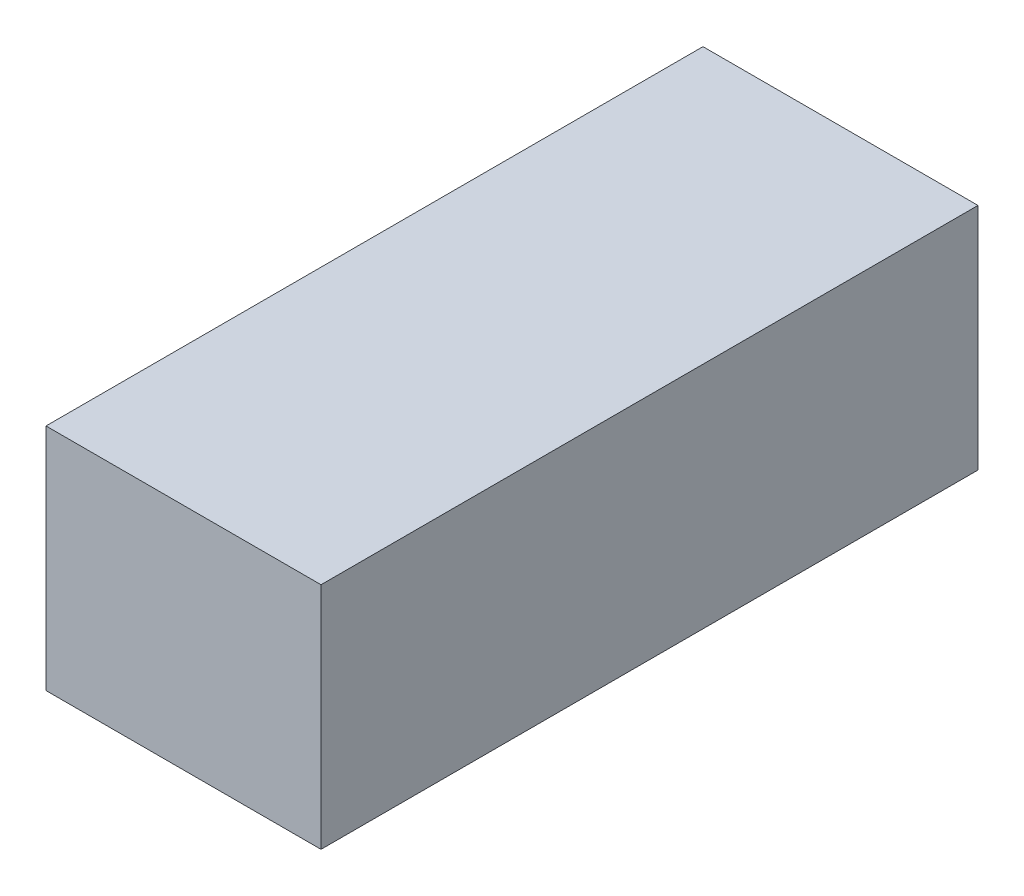
ISO-10303-21;
HEADER;
FILE_DESCRIPTION(('STEP AP214'),'2;1');
FILE_NAME('part.step','',(''),(''),'','','');
FILE_SCHEMA(('AUTOMOTIVE_DESIGN { 1 0 10303 214 1 1 1 1 }'));
ENDSEC;
DATA;
#1=APPLICATION_CONTEXT('core data for automotive mechanical design processes');
#2=APPLICATION_PROTOCOL_DEFINITION('international standard','automotive_design',2000,#1);
#3=PRODUCT_CONTEXT('',#1,'mechanical');
#4=PRODUCT('Part','Part','',(#3));
#5=PRODUCT_RELATED_PRODUCT_CATEGORY('part','',(#4));
#6=PRODUCT_DEFINITION_FORMATION('','',#4);
#7=PRODUCT_DEFINITION_CONTEXT('part definition',#1,'design');
#8=PRODUCT_DEFINITION('design','',#6,#7);
#9=PRODUCT_DEFINITION_SHAPE('','',#8);
#10=(LENGTH_UNIT() NAMED_UNIT(*) SI_UNIT(.MILLI.,.METRE.));
#11=(NAMED_UNIT(*) PLANE_ANGLE_UNIT() SI_UNIT($,.RADIAN.));
#12=(NAMED_UNIT(*) SI_UNIT($,.STERADIAN.) SOLID_ANGLE_UNIT());
#13=UNCERTAINTY_MEASURE_WITH_UNIT(LENGTH_MEASURE(1.E-05),#10,'distance_accuracy_value','');
#14=(GEOMETRIC_REPRESENTATION_CONTEXT(3) GLOBAL_UNCERTAINTY_ASSIGNED_CONTEXT((#13)) GLOBAL_UNIT_ASSIGNED_CONTEXT((#10,
#11,#12)) REPRESENTATION_CONTEXT('',''));
#15=CARTESIAN_POINT('',(0.,0.,0.));
#16=DIRECTION('',(0.,0.,1.));
#17=DIRECTION('',(1.,0.,0.));
#18=AXIS2_PLACEMENT_3D('',#15,#16,#17);
#19=CARTESIAN_POINT('',(-9.,15.,21.5));
#20=DIRECTION('',(1.,0.,0.));
#21=DIRECTION('',(0.,1.,0.));
#22=AXIS2_PLACEMENT_3D('',#19,#20,#21);
#23=PLANE('',#22);
#24=DIRECTION('',(0.,-1.,0.));
#25=VECTOR('',#24,1.);
#26=CARTESIAN_POINT('',(-9.,15.,-21.5));
#27=LINE('',#26,#25);
#28=CARTESIAN_POINT('',(-9.,15.,-21.5));
#29=VERTEX_POINT('',#28);
#30=CARTESIAN_POINT('',(-9.,0.,-21.5));
#31=VERTEX_POINT('',#30);
#32=EDGE_CURVE('E96',#29,#31,#27,.T.);
#33=ORIENTED_EDGE('',*,*,#32,.T.);
#34=DIRECTION('',(0.,0.,-1.));
#35=VECTOR('',#34,1.);
#36=CARTESIAN_POINT('',(-9.,0.,21.5));
#37=LINE('',#36,#35);
#38=CARTESIAN_POINT('',(-9.,0.,21.5));
#39=VERTEX_POINT('',#38);
#40=EDGE_CURVE('E11',#39,#31,#37,.T.);
#41=ORIENTED_EDGE('',*,*,#40,.F.);
#42=DIRECTION('',(0.,-1.,0.));
#43=VECTOR('',#42,1.);
#44=CARTESIAN_POINT('',(-9.,15.,21.5));
#45=LINE('',#44,#43);
#46=CARTESIAN_POINT('',(-9.,15.,21.5));
#47=VERTEX_POINT('',#46);
#48=EDGE_CURVE('E84',#47,#39,#45,.T.);
#49=ORIENTED_EDGE('',*,*,#48,.F.);
#50=DIRECTION('',(0.,0.,-1.));
#51=VECTOR('',#50,1.);
#52=CARTESIAN_POINT('',(-9.,15.,21.5));
#53=LINE('',#52,#51);
#54=EDGE_CURVE('E92',#47,#29,#53,.T.);
#55=ORIENTED_EDGE('',*,*,#54,.T.);
#56=EDGE_LOOP('',(#33,#41,#49,#55));
#57=FACE_BOUND('',#56,.T.);
#58=ADVANCED_FACE('F33',(#57),#23,.F.);
#59=CARTESIAN_POINT('',(-9.,0.,21.5));
#60=DIRECTION('',(0.,1.,0.));
#61=DIRECTION('',(0.,0.,1.));
#62=AXIS2_PLACEMENT_3D('',#59,#60,#61);
#63=PLANE('',#62);
#64=DIRECTION('',(1.,0.,0.));
#65=VECTOR('',#64,1.);
#66=CARTESIAN_POINT('',(-9.,0.,-21.5));
#67=LINE('',#66,#65);
#68=CARTESIAN_POINT('',(9.,0.,-21.5));
#69=VERTEX_POINT('',#68);
#70=EDGE_CURVE('E88',#31,#69,#67,.T.);
#71=ORIENTED_EDGE('',*,*,#70,.T.);
#72=DIRECTION('',(0.,0.,-1.));
#73=VECTOR('',#72,1.);
#74=CARTESIAN_POINT('',(9.,0.,21.5));
#75=LINE('',#74,#73);
#76=CARTESIAN_POINT('',(9.,0.,21.5));
#77=VERTEX_POINT('',#76);
#78=EDGE_CURVE('E41',#77,#69,#75,.T.);
#79=ORIENTED_EDGE('',*,*,#78,.F.);
#80=DIRECTION('',(1.,0.,0.));
#81=VECTOR('',#80,1.);
#82=CARTESIAN_POINT('',(-9.,0.,21.5));
#83=LINE('',#82,#81);
#84=EDGE_CURVE('E79',#39,#77,#83,.T.);
#85=ORIENTED_EDGE('',*,*,#84,.F.);
#86=ORIENTED_EDGE('',*,*,#40,.T.);
#87=EDGE_LOOP('',(#71,#79,#85,#86));
#88=FACE_BOUND('',#87,.T.);
#89=ADVANCED_FACE('F87',(#88),#63,.F.);
#90=CARTESIAN_POINT('',(9.,0.,21.5));
#91=DIRECTION('',(-1.,0.,0.));
#92=DIRECTION('',(0.,-1.,0.));
#93=AXIS2_PLACEMENT_3D('',#90,#91,#92);
#94=PLANE('',#93);
#95=DIRECTION('',(0.,1.,0.));
#96=VECTOR('',#95,1.);
#97=CARTESIAN_POINT('',(9.,0.,-21.5));
#98=LINE('',#97,#96);
#99=CARTESIAN_POINT('',(9.,15.,-21.5));
#100=VERTEX_POINT('',#99);
#101=EDGE_CURVE('E66',#69,#100,#98,.T.);
#102=ORIENTED_EDGE('',*,*,#101,.T.);
#103=DIRECTION('',(0.,0.,-1.));
#104=VECTOR('',#103,1.);
#105=CARTESIAN_POINT('',(9.,15.,21.5));
#106=LINE('',#105,#104);
#107=CARTESIAN_POINT('',(9.,15.,21.5));
#108=VERTEX_POINT('',#107);
#109=EDGE_CURVE('E89',#108,#100,#106,.T.);
#110=ORIENTED_EDGE('',*,*,#109,.F.);
#111=DIRECTION('',(0.,1.,0.));
#112=VECTOR('',#111,1.);
#113=CARTESIAN_POINT('',(9.,0.,21.5));
#114=LINE('',#113,#112);
#115=EDGE_CURVE('E82',#77,#108,#114,.T.);
#116=ORIENTED_EDGE('',*,*,#115,.F.);
#117=ORIENTED_EDGE('',*,*,#78,.T.);
#118=EDGE_LOOP('',(#102,#110,#116,#117));
#119=FACE_BOUND('',#118,.T.);
#120=ADVANCED_FACE('F90',(#119),#94,.F.);
#121=CARTESIAN_POINT('',(9.,15.,21.5));
#122=DIRECTION('',(0.,-1.,0.));
#123=DIRECTION('',(0.,0.,-1.));
#124=AXIS2_PLACEMENT_3D('',#121,#122,#123);
#125=PLANE('',#124);
#126=DIRECTION('',(-1.,0.,0.));
#127=VECTOR('',#126,1.);
#128=CARTESIAN_POINT('',(9.,15.,-21.5));
#129=LINE('',#128,#127);
#130=EDGE_CURVE('E72',#100,#29,#129,.T.);
#131=ORIENTED_EDGE('',*,*,#130,.T.);
#132=ORIENTED_EDGE('',*,*,#54,.F.);
#133=DIRECTION('',(-1.,0.,0.));
#134=VECTOR('',#133,1.);
#135=CARTESIAN_POINT('',(9.,15.,21.5));
#136=LINE('',#135,#134);
#137=EDGE_CURVE('E49',#108,#47,#136,.T.);
#138=ORIENTED_EDGE('',*,*,#137,.F.);
#139=ORIENTED_EDGE('',*,*,#109,.T.);
#140=EDGE_LOOP('',(#131,#132,#138,#139));
#141=FACE_BOUND('',#140,.T.);
#142=ADVANCED_FACE('F103',(#141),#125,.F.);
#143=CARTESIAN_POINT('',(0.,0.,21.5));
#144=DIRECTION('',(0.,0.,1.));
#145=DIRECTION('',(1.,0.,0.));
#146=AXIS2_PLACEMENT_3D('',#143,#144,#145);
#147=PLANE('',#146);
#148=ORIENTED_EDGE('',*,*,#48,.T.);
#149=ORIENTED_EDGE('',*,*,#84,.T.);
#150=ORIENTED_EDGE('',*,*,#115,.T.);
#151=ORIENTED_EDGE('',*,*,#137,.T.);
#152=EDGE_LOOP('',(#148,#149,#150,#151));
#153=FACE_BOUND('',#152,.T.);
#154=ADVANCED_FACE('F80',(#153),#147,.T.);
#155=CARTESIAN_POINT('',(0.,0.,-21.5));
#156=DIRECTION('',(0.,0.,1.));
#157=DIRECTION('',(1.,0.,0.));
#158=AXIS2_PLACEMENT_3D('',#155,#156,#157);
#159=PLANE('',#158);
#160=ORIENTED_EDGE('',*,*,#32,.F.);
#161=ORIENTED_EDGE('',*,*,#130,.F.);
#162=ORIENTED_EDGE('',*,*,#101,.F.);
#163=ORIENTED_EDGE('',*,*,#70,.F.);
#164=EDGE_LOOP('',(#160,#161,#162,#163));
#165=FACE_BOUND('',#164,.T.);
#166=ADVANCED_FACE('F106',(#165),#159,.F.);
#167=CLOSED_SHELL('',(#58,#89,#120,#142,#154,#166));
#168=MANIFOLD_SOLID_BREP('B2',#167);
#169=ADVANCED_BREP_SHAPE_REPRESENTATION('',(#18,#168),#14);
#170=SHAPE_DEFINITION_REPRESENTATION(#9,#169);
ENDSEC;
END-ISO-10303-21;
